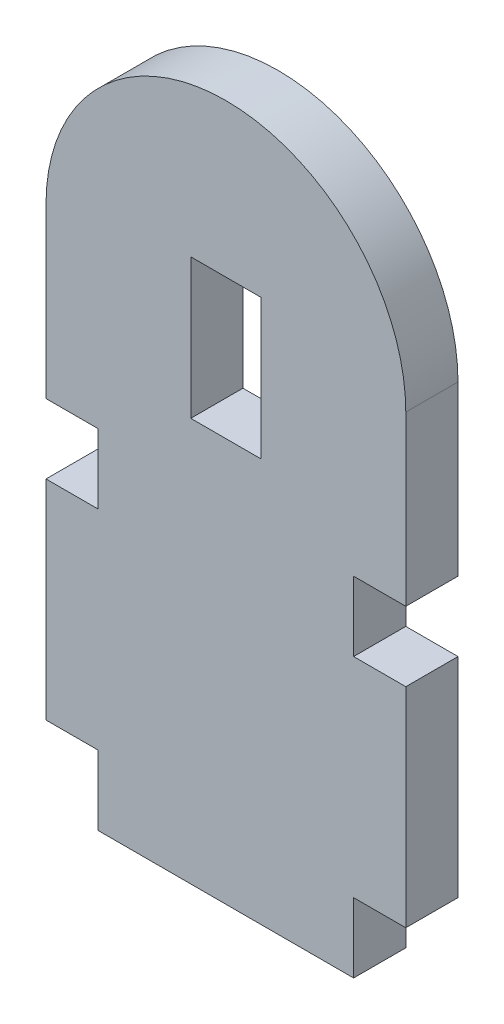
ISO-10303-21;
HEADER;
FILE_DESCRIPTION(('STEP AP214'),'2;1');
FILE_NAME('part.step','',(''),(''),'','','');
FILE_SCHEMA(('AUTOMOTIVE_DESIGN { 1 0 10303 214 1 1 1 1 }'));
ENDSEC;
DATA;
#1=APPLICATION_CONTEXT('core data for automotive mechanical design processes');
#2=APPLICATION_PROTOCOL_DEFINITION('international standard','automotive_design',2000,#1);
#3=PRODUCT_CONTEXT('',#1,'mechanical');
#4=PRODUCT('Part','Part','',(#3));
#5=PRODUCT_RELATED_PRODUCT_CATEGORY('part','',(#4));
#6=PRODUCT_DEFINITION_FORMATION('','',#4);
#7=PRODUCT_DEFINITION_CONTEXT('part definition',#1,'design');
#8=PRODUCT_DEFINITION('design','',#6,#7);
#9=PRODUCT_DEFINITION_SHAPE('','',#8);
#10=(LENGTH_UNIT() NAMED_UNIT(*) SI_UNIT(.MILLI.,.METRE.));
#11=(NAMED_UNIT(*) PLANE_ANGLE_UNIT() SI_UNIT($,.RADIAN.));
#12=(NAMED_UNIT(*) SI_UNIT($,.STERADIAN.) SOLID_ANGLE_UNIT());
#13=UNCERTAINTY_MEASURE_WITH_UNIT(LENGTH_MEASURE(1.E-05),#10,'distance_accuracy_value','');
#14=(GEOMETRIC_REPRESENTATION_CONTEXT(3) GLOBAL_UNCERTAINTY_ASSIGNED_CONTEXT((#13)) GLOBAL_UNIT_ASSIGNED_CONTEXT((#10,
#11,#12)) REPRESENTATION_CONTEXT('',''));
#15=CARTESIAN_POINT('',(0.,0.,0.));
#16=DIRECTION('',(0.,0.,1.));
#17=DIRECTION('',(1.,0.,0.));
#18=AXIS2_PLACEMENT_3D('',#15,#16,#17);
#19=CARTESIAN_POINT('',(1.44568823878412,73.3266826023532,15.));
#20=DIRECTION('',(0.,0.,1.));
#21=DIRECTION('',(1.,0.,0.));
#22=AXIS2_PLACEMENT_3D('',#19,#20,#21);
#23=PLANE('',#22);
#24=DIRECTION('',(0.,1.,0.));
#25=VECTOR('',#24,1.);
#26=CARTESIAN_POINT('',(53.1406882387841,-55.,15.));
#27=LINE('',#26,#25);
#28=CARTESIAN_POINT('',(53.1406882387841,-55.,15.));
#29=VERTEX_POINT('',#28);
#30=CARTESIAN_POINT('',(53.1406882387841,5.00000000000001,15.));
#31=VERTEX_POINT('',#30);
#32=EDGE_CURVE('E264',#29,#31,#27,.T.);
#33=ORIENTED_EDGE('',*,*,#32,.T.);
#34=DIRECTION('',(-1.,0.,0.));
#35=VECTOR('',#34,1.);
#36=CARTESIAN_POINT('',(53.1406882387841,5.00000000000001,15.));
#37=LINE('',#36,#35);
#38=CARTESIAN_POINT('',(38.1406882387842,5.00000000000001,15.));
#39=VERTEX_POINT('',#38);
#40=EDGE_CURVE('E267',#31,#39,#37,.T.);
#41=ORIENTED_EDGE('',*,*,#40,.T.);
#42=DIRECTION('',(0.,1.,0.));
#43=VECTOR('',#42,1.);
#44=CARTESIAN_POINT('',(38.1406882387842,5.00000000000001,15.));
#45=LINE('',#44,#43);
#46=CARTESIAN_POINT('',(38.1406882387841,25.,15.));
#47=VERTEX_POINT('',#46);
#48=EDGE_CURVE('E270',#39,#47,#45,.T.);
#49=ORIENTED_EDGE('',*,*,#48,.T.);
#50=DIRECTION('',(-1.,0.,0.));
#51=VECTOR('',#50,1.);
#52=CARTESIAN_POINT('',(53.1406882387841,25.,15.));
#53=LINE('',#52,#51);
#54=CARTESIAN_POINT('',(53.1406882387841,25.,15.));
#55=VERTEX_POINT('',#54);
#56=EDGE_CURVE('E272',#55,#47,#53,.T.);
#57=ORIENTED_EDGE('',*,*,#56,.F.);
#58=DIRECTION('',(0.,1.,0.));
#59=VECTOR('',#58,1.);
#60=CARTESIAN_POINT('',(53.1406882387841,25.,15.));
#61=LINE('',#60,#59);
#62=CARTESIAN_POINT('',(53.1406882387841,73.3266826023532,15.));
#63=VERTEX_POINT('',#62);
#64=EDGE_CURVE('E275',#55,#63,#61,.T.);
#65=ORIENTED_EDGE('',*,*,#64,.T.);
#66=CARTESIAN_POINT('',(1.44568823878412,73.3266826023532,15.));
#67=DIRECTION('',(0.,0.,1.));
#68=DIRECTION('',(1.,0.,0.));
#69=AXIS2_PLACEMENT_3D('',#66,#67,#68);
#70=CIRCLE('',#69,51.695);
#71=CARTESIAN_POINT('',(-50.2493117612159,73.3266826023532,15.));
#72=VERTEX_POINT('',#71);
#73=EDGE_CURVE('E277',#63,#72,#70,.T.);
#74=ORIENTED_EDGE('',*,*,#73,.T.);
#75=DIRECTION('',(0.,1.,0.));
#76=VECTOR('',#75,1.);
#77=CARTESIAN_POINT('',(-50.2493117612159,25.,15.));
#78=LINE('',#77,#76);
#79=CARTESIAN_POINT('',(-50.2493117612159,25.,15.));
#80=VERTEX_POINT('',#79);
#81=EDGE_CURVE('E279',#80,#72,#78,.T.);
#82=ORIENTED_EDGE('',*,*,#81,.F.);
#83=DIRECTION('',(1.,0.,0.));
#84=VECTOR('',#83,1.);
#85=CARTESIAN_POINT('',(-50.2493117612159,25.,15.));
#86=LINE('',#85,#84);
#87=CARTESIAN_POINT('',(-35.2493117612159,25.,15.));
#88=VERTEX_POINT('',#87);
#89=EDGE_CURVE('E282',#80,#88,#86,.T.);
#90=ORIENTED_EDGE('',*,*,#89,.T.);
#91=DIRECTION('',(0.,1.,0.));
#92=VECTOR('',#91,1.);
#93=CARTESIAN_POINT('',(-35.2493117612159,5.,15.));
#94=LINE('',#93,#92);
#95=CARTESIAN_POINT('',(-35.2493117612159,5.,15.));
#96=VERTEX_POINT('',#95);
#97=EDGE_CURVE('E284',#96,#88,#94,.T.);
#98=ORIENTED_EDGE('',*,*,#97,.F.);
#99=DIRECTION('',(1.,0.,0.));
#100=VECTOR('',#99,1.);
#101=CARTESIAN_POINT('',(-50.2493117612159,5.,15.));
#102=LINE('',#101,#100);
#103=CARTESIAN_POINT('',(-50.2493117612159,5.,15.));
#104=VERTEX_POINT('',#103);
#105=EDGE_CURVE('E287',#104,#96,#102,.T.);
#106=ORIENTED_EDGE('',*,*,#105,.F.);
#107=DIRECTION('',(0.,1.,0.));
#108=VECTOR('',#107,1.);
#109=CARTESIAN_POINT('',(-50.2493117612159,-55.,15.));
#110=LINE('',#109,#108);
#111=CARTESIAN_POINT('',(-50.2493117612159,-55.,15.));
#112=VERTEX_POINT('',#111);
#113=EDGE_CURVE('E290',#112,#104,#110,.T.);
#114=ORIENTED_EDGE('',*,*,#113,.F.);
#115=DIRECTION('',(1.,0.,0.));
#116=VECTOR('',#115,1.);
#117=CARTESIAN_POINT('',(-50.2493117612159,-55.,15.));
#118=LINE('',#117,#116);
#119=CARTESIAN_POINT('',(-35.2493117612159,-55.,15.));
#120=VERTEX_POINT('',#119);
#121=EDGE_CURVE('E293',#112,#120,#118,.T.);
#122=ORIENTED_EDGE('',*,*,#121,.T.);
#123=DIRECTION('',(0.,-1.,0.));
#124=VECTOR('',#123,1.);
#125=CARTESIAN_POINT('',(-35.2493117612159,-55.,15.));
#126=LINE('',#125,#124);
#127=CARTESIAN_POINT('',(-35.2493117612159,-75.,15.));
#128=VERTEX_POINT('',#127);
#129=EDGE_CURVE('E295',#120,#128,#126,.T.);
#130=ORIENTED_EDGE('',*,*,#129,.T.);
#131=DIRECTION('',(1.,0.,0.));
#132=VECTOR('',#131,1.);
#133=CARTESIAN_POINT('',(-35.2493117612159,-75.,15.));
#134=LINE('',#133,#132);
#135=CARTESIAN_POINT('',(38.1406882387842,-75.,15.));
#136=VERTEX_POINT('',#135);
#137=EDGE_CURVE('E297',#128,#136,#134,.T.);
#138=ORIENTED_EDGE('',*,*,#137,.T.);
#139=DIRECTION('',(0.,-1.,0.));
#140=VECTOR('',#139,1.);
#141=CARTESIAN_POINT('',(38.1406882387841,-55.,15.));
#142=LINE('',#141,#140);
#143=CARTESIAN_POINT('',(38.1406882387841,-55.,15.));
#144=VERTEX_POINT('',#143);
#145=EDGE_CURVE('E299',#144,#136,#142,.T.);
#146=ORIENTED_EDGE('',*,*,#145,.F.);
#147=DIRECTION('',(-1.,0.,0.));
#148=VECTOR('',#147,1.);
#149=CARTESIAN_POINT('',(53.1406882387841,-55.,15.));
#150=LINE('',#149,#148);
#151=EDGE_CURVE('E302',#29,#144,#150,.T.);
#152=ORIENTED_EDGE('',*,*,#151,.F.);
#153=EDGE_LOOP('',(#33,#41,#49,#57,#65,#74,#82,#90,#98,#106,#114,#122,#130,#138,#146,#152));
#154=FACE_BOUND('',#153,.T.);
#155=DIRECTION('',(0.,1.,0.));
#156=VECTOR('',#155,1.);
#157=CARTESIAN_POINT('',(11.5456882387841,40.8827675331254,15.));
#158=LINE('',#157,#156);
#159=CARTESIAN_POINT('',(11.5456882387841,40.8827675331254,15.));
#160=VERTEX_POINT('',#159);
#161=CARTESIAN_POINT('',(11.5456882387841,81.0827675331254,15.));
#162=VERTEX_POINT('',#161);
#163=EDGE_CURVE('E238',#160,#162,#158,.T.);
#164=ORIENTED_EDGE('',*,*,#163,.F.);
#165=DIRECTION('',(1.,0.,0.));
#166=VECTOR('',#165,1.);
#167=CARTESIAN_POINT('',(-8.65431176121588,40.8827675331254,15.));
#168=LINE('',#167,#166);
#169=CARTESIAN_POINT('',(-8.65431176121588,40.8827675331254,15.));
#170=VERTEX_POINT('',#169);
#171=EDGE_CURVE('E229',#170,#160,#168,.T.);
#172=ORIENTED_EDGE('',*,*,#171,.F.);
#173=DIRECTION('',(0.,1.,0.));
#174=VECTOR('',#173,1.);
#175=CARTESIAN_POINT('',(-8.65431176121588,40.8827675331254,15.));
#176=LINE('',#175,#174);
#177=CARTESIAN_POINT('',(-8.65431176121588,81.0827675331254,15.));
#178=VERTEX_POINT('',#177);
#179=EDGE_CURVE('E249',#170,#178,#176,.T.);
#180=ORIENTED_EDGE('',*,*,#179,.T.);
#181=DIRECTION('',(1.,0.,0.));
#182=VECTOR('',#181,1.);
#183=CARTESIAN_POINT('',(-8.65431176121588,81.0827675331254,15.));
#184=LINE('',#183,#182);
#185=EDGE_CURVE('E107',#178,#162,#184,.T.);
#186=ORIENTED_EDGE('',*,*,#185,.T.);
#187=EDGE_LOOP('',(#164,#172,#180,#186));
#188=FACE_BOUND('',#187,.T.);
#189=ADVANCED_FACE('F92',(#154,#188),#23,.T.);
#190=CARTESIAN_POINT('',(1.44568823878412,73.3266826023532,0.));
#191=DIRECTION('',(0.,0.,1.));
#192=DIRECTION('',(1.,0.,0.));
#193=AXIS2_PLACEMENT_3D('',#190,#191,#192);
#194=PLANE('',#193);
#195=DIRECTION('',(0.,1.,0.));
#196=VECTOR('',#195,1.);
#197=CARTESIAN_POINT('',(53.1406882387841,-55.,0.));
#198=LINE('',#197,#196);
#199=CARTESIAN_POINT('',(53.1406882387841,-55.,0.));
#200=VERTEX_POINT('',#199);
#201=CARTESIAN_POINT('',(53.1406882387841,5.00000000000001,0.));
#202=VERTEX_POINT('',#201);
#203=EDGE_CURVE('E245',#200,#202,#198,.T.);
#204=ORIENTED_EDGE('',*,*,#203,.F.);
#205=DIRECTION('',(-1.,0.,0.));
#206=VECTOR('',#205,1.);
#207=CARTESIAN_POINT('',(53.1406882387841,-55.,0.));
#208=LINE('',#207,#206);
#209=CARTESIAN_POINT('',(38.1406882387841,-55.,0.));
#210=VERTEX_POINT('',#209);
#211=EDGE_CURVE('E268',#200,#210,#208,.T.);
#212=ORIENTED_EDGE('',*,*,#211,.T.);
#213=DIRECTION('',(0.,-1.,0.));
#214=VECTOR('',#213,1.);
#215=CARTESIAN_POINT('',(38.1406882387841,-55.,0.));
#216=LINE('',#215,#214);
#217=CARTESIAN_POINT('',(38.1406882387842,-75.,0.));
#218=VERTEX_POINT('',#217);
#219=EDGE_CURVE('E343',#210,#218,#216,.T.);
#220=ORIENTED_EDGE('',*,*,#219,.T.);
#221=DIRECTION('',(1.,0.,0.));
#222=VECTOR('',#221,1.);
#223=CARTESIAN_POINT('',(-35.2493117612159,-75.,0.));
#224=LINE('',#223,#222);
#225=CARTESIAN_POINT('',(-35.2493117612159,-75.,0.));
#226=VERTEX_POINT('',#225);
#227=EDGE_CURVE('E340',#226,#218,#224,.T.);
#228=ORIENTED_EDGE('',*,*,#227,.F.);
#229=DIRECTION('',(0.,-1.,0.));
#230=VECTOR('',#229,1.);
#231=CARTESIAN_POINT('',(-35.2493117612159,-55.,0.));
#232=LINE('',#231,#230);
#233=CARTESIAN_POINT('',(-35.2493117612159,-55.,0.));
#234=VERTEX_POINT('',#233);
#235=EDGE_CURVE('E338',#234,#226,#232,.T.);
#236=ORIENTED_EDGE('',*,*,#235,.F.);
#237=DIRECTION('',(1.,0.,0.));
#238=VECTOR('',#237,1.);
#239=CARTESIAN_POINT('',(-50.2493117612159,-55.,0.));
#240=LINE('',#239,#238);
#241=CARTESIAN_POINT('',(-50.2493117612159,-55.,0.));
#242=VERTEX_POINT('',#241);
#243=EDGE_CURVE('E336',#242,#234,#240,.T.);
#244=ORIENTED_EDGE('',*,*,#243,.F.);
#245=DIRECTION('',(0.,1.,0.));
#246=VECTOR('',#245,1.);
#247=CARTESIAN_POINT('',(-50.2493117612159,-55.,0.));
#248=LINE('',#247,#246);
#249=CARTESIAN_POINT('',(-50.2493117612159,5.,0.));
#250=VERTEX_POINT('',#249);
#251=EDGE_CURVE('E333',#242,#250,#248,.T.);
#252=ORIENTED_EDGE('',*,*,#251,.T.);
#253=DIRECTION('',(1.,0.,0.));
#254=VECTOR('',#253,1.);
#255=CARTESIAN_POINT('',(-50.2493117612159,5.,0.));
#256=LINE('',#255,#254);
#257=CARTESIAN_POINT('',(-35.2493117612159,5.,0.));
#258=VERTEX_POINT('',#257);
#259=EDGE_CURVE('E330',#250,#258,#256,.T.);
#260=ORIENTED_EDGE('',*,*,#259,.T.);
#261=DIRECTION('',(0.,1.,0.));
#262=VECTOR('',#261,1.);
#263=CARTESIAN_POINT('',(-35.2493117612159,5.,0.));
#264=LINE('',#263,#262);
#265=CARTESIAN_POINT('',(-35.2493117612159,25.,0.));
#266=VERTEX_POINT('',#265);
#267=EDGE_CURVE('E327',#258,#266,#264,.T.);
#268=ORIENTED_EDGE('',*,*,#267,.T.);
#269=DIRECTION('',(1.,0.,0.));
#270=VECTOR('',#269,1.);
#271=CARTESIAN_POINT('',(-50.2493117612159,25.,0.));
#272=LINE('',#271,#270);
#273=CARTESIAN_POINT('',(-50.2493117612159,25.,0.));
#274=VERTEX_POINT('',#273);
#275=EDGE_CURVE('E324',#274,#266,#272,.T.);
#276=ORIENTED_EDGE('',*,*,#275,.F.);
#277=DIRECTION('',(0.,1.,0.));
#278=VECTOR('',#277,1.);
#279=CARTESIAN_POINT('',(-50.2493117612159,25.,0.));
#280=LINE('',#279,#278);
#281=CARTESIAN_POINT('',(-50.2493117612159,73.3266826023532,0.));
#282=VERTEX_POINT('',#281);
#283=EDGE_CURVE('E321',#274,#282,#280,.T.);
#284=ORIENTED_EDGE('',*,*,#283,.T.);
#285=CARTESIAN_POINT('',(1.44568823878412,73.3266826023532,0.));
#286=DIRECTION('',(0.,0.,1.));
#287=DIRECTION('',(1.,0.,0.));
#288=AXIS2_PLACEMENT_3D('',#285,#286,#287);
#289=CIRCLE('',#288,51.695);
#290=CARTESIAN_POINT('',(53.1406882387841,73.3266826023532,0.));
#291=VERTEX_POINT('',#290);
#292=EDGE_CURVE('E318',#291,#282,#289,.T.);
#293=ORIENTED_EDGE('',*,*,#292,.F.);
#294=DIRECTION('',(0.,1.,0.));
#295=VECTOR('',#294,1.);
#296=CARTESIAN_POINT('',(53.1406882387841,25.,0.));
#297=LINE('',#296,#295);
#298=CARTESIAN_POINT('',(53.1406882387841,25.,0.));
#299=VERTEX_POINT('',#298);
#300=EDGE_CURVE('E316',#299,#291,#297,.T.);
#301=ORIENTED_EDGE('',*,*,#300,.F.);
#302=DIRECTION('',(-1.,0.,0.));
#303=VECTOR('',#302,1.);
#304=CARTESIAN_POINT('',(53.1406882387841,25.,0.));
#305=LINE('',#304,#303);
#306=CARTESIAN_POINT('',(38.1406882387841,25.,0.));
#307=VERTEX_POINT('',#306);
#308=EDGE_CURVE('E313',#299,#307,#305,.T.);
#309=ORIENTED_EDGE('',*,*,#308,.T.);
#310=DIRECTION('',(0.,1.,0.));
#311=VECTOR('',#310,1.);
#312=CARTESIAN_POINT('',(38.1406882387842,5.00000000000001,0.));
#313=LINE('',#312,#311);
#314=CARTESIAN_POINT('',(38.1406882387842,5.00000000000001,0.));
#315=VERTEX_POINT('',#314);
#316=EDGE_CURVE('E310',#315,#307,#313,.T.);
#317=ORIENTED_EDGE('',*,*,#316,.F.);
#318=DIRECTION('',(-1.,0.,0.));
#319=VECTOR('',#318,1.);
#320=CARTESIAN_POINT('',(53.1406882387841,5.00000000000001,0.));
#321=LINE('',#320,#319);
#322=EDGE_CURVE('E308',#202,#315,#321,.T.);
#323=ORIENTED_EDGE('',*,*,#322,.F.);
#324=EDGE_LOOP('',(#204,#212,#220,#228,#236,#244,#252,#260,#268,#276,#284,#293,#301,#309,#317,#323));
#325=FACE_BOUND('',#324,.T.);
#326=DIRECTION('',(1.,0.,0.));
#327=VECTOR('',#326,1.);
#328=CARTESIAN_POINT('',(-8.65431176121588,40.8827675331254,0.));
#329=LINE('',#328,#327);
#330=CARTESIAN_POINT('',(-8.65431176121588,40.8827675331254,0.));
#331=VERTEX_POINT('',#330);
#332=CARTESIAN_POINT('',(11.5456882387841,40.8827675331254,0.));
#333=VERTEX_POINT('',#332);
#334=EDGE_CURVE('E115',#331,#333,#329,.T.);
#335=ORIENTED_EDGE('',*,*,#334,.T.);
#336=DIRECTION('',(0.,1.,0.));
#337=VECTOR('',#336,1.);
#338=CARTESIAN_POINT('',(11.5456882387841,40.8827675331254,0.));
#339=LINE('',#338,#337);
#340=CARTESIAN_POINT('',(11.5456882387841,81.0827675331254,0.));
#341=VERTEX_POINT('',#340);
#342=EDGE_CURVE('E244',#333,#341,#339,.T.);
#343=ORIENTED_EDGE('',*,*,#342,.T.);
#344=DIRECTION('',(1.,0.,0.));
#345=VECTOR('',#344,1.);
#346=CARTESIAN_POINT('',(-8.65431176121588,81.0827675331254,0.));
#347=LINE('',#346,#345);
#348=CARTESIAN_POINT('',(-8.65431176121588,81.0827675331254,0.));
#349=VERTEX_POINT('',#348);
#350=EDGE_CURVE('E255',#349,#341,#347,.T.);
#351=ORIENTED_EDGE('',*,*,#350,.F.);
#352=DIRECTION('',(0.,1.,0.));
#353=VECTOR('',#352,1.);
#354=CARTESIAN_POINT('',(-8.65431176121588,40.8827675331254,0.));
#355=LINE('',#354,#353);
#356=EDGE_CURVE('E239',#331,#349,#355,.T.);
#357=ORIENTED_EDGE('',*,*,#356,.F.);
#358=EDGE_LOOP('',(#335,#343,#351,#357));
#359=FACE_BOUND('',#358,.T.);
#360=ADVANCED_FACE('F387',(#325,#359),#194,.F.);
#361=CARTESIAN_POINT('',(53.1406882387841,-55.,15.));
#362=DIRECTION('',(-1.,0.,0.));
#363=DIRECTION('',(0.,0.,1.));
#364=AXIS2_PLACEMENT_3D('',#361,#362,#363);
#365=PLANE('',#364);
#366=ORIENTED_EDGE('',*,*,#203,.T.);
#367=DIRECTION('',(0.,0.,-1.));
#368=VECTOR('',#367,1.);
#369=CARTESIAN_POINT('',(53.1406882387841,5.00000000000001,15.));
#370=LINE('',#369,#368);
#371=EDGE_CURVE('E12',#31,#202,#370,.T.);
#372=ORIENTED_EDGE('',*,*,#371,.F.);
#373=ORIENTED_EDGE('',*,*,#32,.F.);
#374=DIRECTION('',(0.,0.,-1.));
#375=VECTOR('',#374,1.);
#376=CARTESIAN_POINT('',(53.1406882387841,-55.,15.));
#377=LINE('',#376,#375);
#378=EDGE_CURVE('E305',#29,#200,#377,.T.);
#379=ORIENTED_EDGE('',*,*,#378,.T.);
#380=EDGE_LOOP('',(#366,#372,#373,#379));
#381=FACE_BOUND('',#380,.T.);
#382=ADVANCED_FACE('F94',(#381),#365,.F.);
#383=CARTESIAN_POINT('',(53.1406882387841,5.00000000000001,15.));
#384=DIRECTION('',(0.,-1.,0.));
#385=DIRECTION('',(0.,0.,-1.));
#386=AXIS2_PLACEMENT_3D('',#383,#384,#385);
#387=PLANE('',#386);
#388=ORIENTED_EDGE('',*,*,#322,.T.);
#389=DIRECTION('',(0.,0.,-1.));
#390=VECTOR('',#389,1.);
#391=CARTESIAN_POINT('',(38.1406882387842,5.00000000000001,15.));
#392=LINE('',#391,#390);
#393=EDGE_CURVE('E100',#39,#315,#392,.T.);
#394=ORIENTED_EDGE('',*,*,#393,.F.);
#395=ORIENTED_EDGE('',*,*,#40,.F.);
#396=ORIENTED_EDGE('',*,*,#371,.T.);
#397=EDGE_LOOP('',(#388,#394,#395,#396));
#398=FACE_BOUND('',#397,.T.);
#399=ADVANCED_FACE('F401',(#398),#387,.F.);
#400=CARTESIAN_POINT('',(38.1406882387842,5.00000000000001,15.));
#401=DIRECTION('',(-1.,0.,0.));
#402=DIRECTION('',(0.,-1.,0.));
#403=AXIS2_PLACEMENT_3D('',#400,#401,#402);
#404=PLANE('',#403);
#405=ORIENTED_EDGE('',*,*,#316,.T.);
#406=DIRECTION('',(0.,0.,-1.));
#407=VECTOR('',#406,1.);
#408=CARTESIAN_POINT('',(38.1406882387841,25.,15.));
#409=LINE('',#408,#407);
#410=EDGE_CURVE('E376',#47,#307,#409,.T.);
#411=ORIENTED_EDGE('',*,*,#410,.F.);
#412=ORIENTED_EDGE('',*,*,#48,.F.);
#413=ORIENTED_EDGE('',*,*,#393,.T.);
#414=EDGE_LOOP('',(#405,#411,#412,#413));
#415=FACE_BOUND('',#414,.T.);
#416=ADVANCED_FACE('F382',(#415),#404,.F.);
#417=CARTESIAN_POINT('',(53.1406882387841,25.,15.));
#418=DIRECTION('',(0.,-1.,0.));
#419=DIRECTION('',(1.,0.,0.));
#420=AXIS2_PLACEMENT_3D('',#417,#418,#419);
#421=PLANE('',#420);
#422=ORIENTED_EDGE('',*,*,#308,.F.);
#423=DIRECTION('',(0.,0.,-1.));
#424=VECTOR('',#423,1.);
#425=CARTESIAN_POINT('',(53.1406882387841,25.,15.));
#426=LINE('',#425,#424);
#427=EDGE_CURVE('E374',#55,#299,#426,.T.);
#428=ORIENTED_EDGE('',*,*,#427,.F.);
#429=ORIENTED_EDGE('',*,*,#56,.T.);
#430=ORIENTED_EDGE('',*,*,#410,.T.);
#431=EDGE_LOOP('',(#422,#428,#429,#430));
#432=FACE_BOUND('',#431,.T.);
#433=ADVANCED_FACE('F393',(#432),#421,.T.);
#434=CARTESIAN_POINT('',(53.1406882387841,25.,15.));
#435=DIRECTION('',(-1.,0.,0.));
#436=DIRECTION('',(0.,-1.,0.));
#437=AXIS2_PLACEMENT_3D('',#434,#435,#436);
#438=PLANE('',#437);
#439=ORIENTED_EDGE('',*,*,#300,.T.);
#440=DIRECTION('',(0.,0.,-1.));
#441=VECTOR('',#440,1.);
#442=CARTESIAN_POINT('',(53.1406882387841,73.3266826023532,15.));
#443=LINE('',#442,#441);
#444=EDGE_CURVE('E371',#63,#291,#443,.T.);
#445=ORIENTED_EDGE('',*,*,#444,.F.);
#446=ORIENTED_EDGE('',*,*,#64,.F.);
#447=ORIENTED_EDGE('',*,*,#427,.T.);
#448=EDGE_LOOP('',(#439,#445,#446,#447));
#449=FACE_BOUND('',#448,.T.);
#450=ADVANCED_FACE('F451',(#449),#438,.F.);
#451=CARTESIAN_POINT('',(1.44568823878412,73.3266826023532,15.));
#452=DIRECTION('',(0.,0.,-1.));
#453=DIRECTION('',(-1.,0.,0.));
#454=AXIS2_PLACEMENT_3D('',#451,#452,#453);
#455=CYLINDRICAL_SURFACE('',#454,51.695);
#456=ORIENTED_EDGE('',*,*,#292,.T.);
#457=DIRECTION('',(0.,0.,-1.));
#458=VECTOR('',#457,1.);
#459=CARTESIAN_POINT('',(-50.2493117612159,73.3266826023532,15.));
#460=LINE('',#459,#458);
#461=EDGE_CURVE('E369',#72,#282,#460,.T.);
#462=ORIENTED_EDGE('',*,*,#461,.F.);
#463=ORIENTED_EDGE('',*,*,#73,.F.);
#464=ORIENTED_EDGE('',*,*,#444,.T.);
#465=EDGE_LOOP('',(#456,#462,#463,#464));
#466=FACE_BOUND('',#465,.T.);
#467=ADVANCED_FACE('F448',(#466),#455,.T.);
#468=CARTESIAN_POINT('',(-50.2493117612159,25.,15.));
#469=DIRECTION('',(-1.,0.,0.));
#470=DIRECTION('',(0.,0.,1.));
#471=AXIS2_PLACEMENT_3D('',#468,#469,#470);
#472=PLANE('',#471);
#473=ORIENTED_EDGE('',*,*,#283,.F.);
#474=DIRECTION('',(0.,0.,-1.));
#475=VECTOR('',#474,1.);
#476=CARTESIAN_POINT('',(-50.2493117612159,25.,15.));
#477=LINE('',#476,#475);
#478=EDGE_CURVE('E367',#80,#274,#477,.T.);
#479=ORIENTED_EDGE('',*,*,#478,.F.);
#480=ORIENTED_EDGE('',*,*,#81,.T.);
#481=ORIENTED_EDGE('',*,*,#461,.T.);
#482=EDGE_LOOP('',(#473,#479,#480,#481));
#483=FACE_BOUND('',#482,.T.);
#484=ADVANCED_FACE('F445',(#483),#472,.T.);
#485=CARTESIAN_POINT('',(-50.2493117612159,25.,15.));
#486=DIRECTION('',(0.,1.,0.));
#487=DIRECTION('',(-1.,0.,0.));
#488=AXIS2_PLACEMENT_3D('',#485,#486,#487);
#489=PLANE('',#488);
#490=ORIENTED_EDGE('',*,*,#275,.T.);
#491=DIRECTION('',(0.,0.,-1.));
#492=VECTOR('',#491,1.);
#493=CARTESIAN_POINT('',(-35.2493117612159,25.,15.));
#494=LINE('',#493,#492);
#495=EDGE_CURVE('E365',#88,#266,#494,.T.);
#496=ORIENTED_EDGE('',*,*,#495,.F.);
#497=ORIENTED_EDGE('',*,*,#89,.F.);
#498=ORIENTED_EDGE('',*,*,#478,.T.);
#499=EDGE_LOOP('',(#490,#496,#497,#498));
#500=FACE_BOUND('',#499,.T.);
#501=ADVANCED_FACE('F442',(#500),#489,.F.);
#502=CARTESIAN_POINT('',(-35.2493117612159,5.,15.));
#503=DIRECTION('',(-1.,0.,0.));
#504=DIRECTION('',(0.,-1.,0.));
#505=AXIS2_PLACEMENT_3D('',#502,#503,#504);
#506=PLANE('',#505);
#507=ORIENTED_EDGE('',*,*,#267,.F.);
#508=DIRECTION('',(0.,0.,-1.));
#509=VECTOR('',#508,1.);
#510=CARTESIAN_POINT('',(-35.2493117612159,5.,15.));
#511=LINE('',#510,#509);
#512=EDGE_CURVE('E363',#96,#258,#511,.T.);
#513=ORIENTED_EDGE('',*,*,#512,.F.);
#514=ORIENTED_EDGE('',*,*,#97,.T.);
#515=ORIENTED_EDGE('',*,*,#495,.T.);
#516=EDGE_LOOP('',(#507,#513,#514,#515));
#517=FACE_BOUND('',#516,.T.);
#518=ADVANCED_FACE('F437',(#517),#506,.T.);
#519=CARTESIAN_POINT('',(-50.2493117612159,5.,15.));
#520=DIRECTION('',(0.,1.,0.));
#521=DIRECTION('',(-1.,0.,0.));
#522=AXIS2_PLACEMENT_3D('',#519,#520,#521);
#523=PLANE('',#522);
#524=ORIENTED_EDGE('',*,*,#259,.F.);
#525=DIRECTION('',(0.,0.,-1.));
#526=VECTOR('',#525,1.);
#527=CARTESIAN_POINT('',(-50.2493117612159,5.,15.));
#528=LINE('',#527,#526);
#529=EDGE_CURVE('E361',#104,#250,#528,.T.);
#530=ORIENTED_EDGE('',*,*,#529,.F.);
#531=ORIENTED_EDGE('',*,*,#105,.T.);
#532=ORIENTED_EDGE('',*,*,#512,.T.);
#533=EDGE_LOOP('',(#524,#530,#531,#532));
#534=FACE_BOUND('',#533,.T.);
#535=ADVANCED_FACE('F432',(#534),#523,.T.);
#536=CARTESIAN_POINT('',(-50.2493117612159,-55.,15.));
#537=DIRECTION('',(-1.,0.,0.));
#538=DIRECTION('',(0.,-1.,0.));
#539=AXIS2_PLACEMENT_3D('',#536,#537,#538);
#540=PLANE('',#539);
#541=ORIENTED_EDGE('',*,*,#251,.F.);
#542=DIRECTION('',(0.,0.,-1.));
#543=VECTOR('',#542,1.);
#544=CARTESIAN_POINT('',(-50.2493117612159,-55.,15.));
#545=LINE('',#544,#543);
#546=EDGE_CURVE('E359',#112,#242,#545,.T.);
#547=ORIENTED_EDGE('',*,*,#546,.F.);
#548=ORIENTED_EDGE('',*,*,#113,.T.);
#549=ORIENTED_EDGE('',*,*,#529,.T.);
#550=EDGE_LOOP('',(#541,#547,#548,#549));
#551=FACE_BOUND('',#550,.T.);
#552=ADVANCED_FACE('F428',(#551),#540,.T.);
#553=CARTESIAN_POINT('',(-50.2493117612159,-55.,15.));
#554=DIRECTION('',(0.,1.,0.));
#555=DIRECTION('',(-1.,0.,0.));
#556=AXIS2_PLACEMENT_3D('',#553,#554,#555);
#557=PLANE('',#556);
#558=ORIENTED_EDGE('',*,*,#243,.T.);
#559=DIRECTION('',(0.,0.,-1.));
#560=VECTOR('',#559,1.);
#561=CARTESIAN_POINT('',(-35.2493117612159,-55.,15.));
#562=LINE('',#561,#560);
#563=EDGE_CURVE('E356',#120,#234,#562,.T.);
#564=ORIENTED_EDGE('',*,*,#563,.F.);
#565=ORIENTED_EDGE('',*,*,#121,.F.);
#566=ORIENTED_EDGE('',*,*,#546,.T.);
#567=EDGE_LOOP('',(#558,#564,#565,#566));
#568=FACE_BOUND('',#567,.T.);
#569=ADVANCED_FACE('F424',(#568),#557,.F.);
#570=CARTESIAN_POINT('',(-35.2493117612159,-55.,15.));
#571=DIRECTION('',(1.,0.,0.));
#572=DIRECTION('',(0.,0.,-1.));
#573=AXIS2_PLACEMENT_3D('',#570,#571,#572);
#574=PLANE('',#573);
#575=ORIENTED_EDGE('',*,*,#235,.T.);
#576=DIRECTION('',(0.,0.,-1.));
#577=VECTOR('',#576,1.);
#578=CARTESIAN_POINT('',(-35.2493117612159,-75.,15.));
#579=LINE('',#578,#577);
#580=EDGE_CURVE('E353',#128,#226,#579,.T.);
#581=ORIENTED_EDGE('',*,*,#580,.F.);
#582=ORIENTED_EDGE('',*,*,#129,.F.);
#583=ORIENTED_EDGE('',*,*,#563,.T.);
#584=EDGE_LOOP('',(#575,#581,#582,#583));
#585=FACE_BOUND('',#584,.T.);
#586=ADVANCED_FACE('F420',(#585),#574,.F.);
#587=CARTESIAN_POINT('',(-35.2493117612159,-75.,15.));
#588=DIRECTION('',(0.,1.,0.));
#589=DIRECTION('',(-1.,0.,0.));
#590=AXIS2_PLACEMENT_3D('',#587,#588,#589);
#591=PLANE('',#590);
#592=ORIENTED_EDGE('',*,*,#227,.T.);
#593=DIRECTION('',(0.,0.,-1.));
#594=VECTOR('',#593,1.);
#595=CARTESIAN_POINT('',(38.1406882387842,-75.,15.));
#596=LINE('',#595,#594);
#597=EDGE_CURVE('E351',#136,#218,#596,.T.);
#598=ORIENTED_EDGE('',*,*,#597,.F.);
#599=ORIENTED_EDGE('',*,*,#137,.F.);
#600=ORIENTED_EDGE('',*,*,#580,.T.);
#601=EDGE_LOOP('',(#592,#598,#599,#600));
#602=FACE_BOUND('',#601,.T.);
#603=ADVANCED_FACE('F415',(#602),#591,.F.);
#604=CARTESIAN_POINT('',(38.1406882387841,-55.,15.));
#605=DIRECTION('',(1.,0.,0.));
#606=DIRECTION('',(0.,1.,0.));
#607=AXIS2_PLACEMENT_3D('',#604,#605,#606);
#608=PLANE('',#607);
#609=ORIENTED_EDGE('',*,*,#219,.F.);
#610=DIRECTION('',(0.,0.,-1.));
#611=VECTOR('',#610,1.);
#612=CARTESIAN_POINT('',(38.1406882387841,-55.,15.));
#613=LINE('',#612,#611);
#614=EDGE_CURVE('E349',#144,#210,#613,.T.);
#615=ORIENTED_EDGE('',*,*,#614,.F.);
#616=ORIENTED_EDGE('',*,*,#145,.T.);
#617=ORIENTED_EDGE('',*,*,#597,.T.);
#618=EDGE_LOOP('',(#609,#615,#616,#617));
#619=FACE_BOUND('',#618,.T.);
#620=ADVANCED_FACE('F409',(#619),#608,.T.);
#621=CARTESIAN_POINT('',(53.1406882387841,-55.,15.));
#622=DIRECTION('',(0.,-1.,0.));
#623=DIRECTION('',(1.,0.,0.));
#624=AXIS2_PLACEMENT_3D('',#621,#622,#623);
#625=PLANE('',#624);
#626=ORIENTED_EDGE('',*,*,#211,.F.);
#627=ORIENTED_EDGE('',*,*,#378,.F.);
#628=ORIENTED_EDGE('',*,*,#151,.T.);
#629=ORIENTED_EDGE('',*,*,#614,.T.);
#630=EDGE_LOOP('',(#626,#627,#628,#629));
#631=FACE_BOUND('',#630,.T.);
#632=ADVANCED_FACE('F405',(#631),#625,.T.);
#633=CARTESIAN_POINT('',(-8.65431176121588,40.8827675331254,15.));
#634=DIRECTION('',(0.,1.,0.));
#635=DIRECTION('',(0.,0.,1.));
#636=AXIS2_PLACEMENT_3D('',#633,#634,#635);
#637=PLANE('',#636);
#638=ORIENTED_EDGE('',*,*,#334,.F.);
#639=DIRECTION('',(0.,0.,-1.));
#640=VECTOR('',#639,1.);
#641=CARTESIAN_POINT('',(-8.65431176121588,40.8827675331254,15.));
#642=LINE('',#641,#640);
#643=EDGE_CURVE('E233',#170,#331,#642,.T.);
#644=ORIENTED_EDGE('',*,*,#643,.F.);
#645=ORIENTED_EDGE('',*,*,#171,.T.);
#646=DIRECTION('',(0.,0.,-1.));
#647=VECTOR('',#646,1.);
#648=CARTESIAN_POINT('',(11.5456882387841,40.8827675331254,15.));
#649=LINE('',#648,#647);
#650=EDGE_CURVE('E232',#160,#333,#649,.T.);
#651=ORIENTED_EDGE('',*,*,#650,.T.);
#652=EDGE_LOOP('',(#638,#644,#645,#651));
#653=FACE_BOUND('',#652,.T.);
#654=ADVANCED_FACE('F231',(#653),#637,.T.);
#655=CARTESIAN_POINT('',(11.5456882387841,40.8827675331254,15.));
#656=DIRECTION('',(-1.,0.,0.));
#657=DIRECTION('',(0.,0.,1.));
#658=AXIS2_PLACEMENT_3D('',#655,#656,#657);
#659=PLANE('',#658);
#660=ORIENTED_EDGE('',*,*,#342,.F.);
#661=ORIENTED_EDGE('',*,*,#650,.F.);
#662=ORIENTED_EDGE('',*,*,#163,.T.);
#663=DIRECTION('',(0.,0.,-1.));
#664=VECTOR('',#663,1.);
#665=CARTESIAN_POINT('',(11.5456882387841,81.0827675331254,15.));
#666=LINE('',#665,#664);
#667=EDGE_CURVE('E246',#162,#341,#666,.T.);
#668=ORIENTED_EDGE('',*,*,#667,.T.);
#669=EDGE_LOOP('',(#660,#661,#662,#668));
#670=FACE_BOUND('',#669,.T.);
#671=ADVANCED_FACE('F242',(#670),#659,.T.);
#672=CARTESIAN_POINT('',(-8.65431176121588,81.0827675331254,15.));
#673=DIRECTION('',(0.,1.,0.));
#674=DIRECTION('',(0.,0.,1.));
#675=AXIS2_PLACEMENT_3D('',#672,#673,#674);
#676=PLANE('',#675);
#677=ORIENTED_EDGE('',*,*,#350,.T.);
#678=ORIENTED_EDGE('',*,*,#667,.F.);
#679=ORIENTED_EDGE('',*,*,#185,.F.);
#680=DIRECTION('',(0.,0.,-1.));
#681=VECTOR('',#680,1.);
#682=CARTESIAN_POINT('',(-8.65431176121588,81.0827675331254,15.));
#683=LINE('',#682,#681);
#684=EDGE_CURVE('E261',#178,#349,#683,.T.);
#685=ORIENTED_EDGE('',*,*,#684,.T.);
#686=EDGE_LOOP('',(#677,#678,#679,#685));
#687=FACE_BOUND('',#686,.T.);
#688=ADVANCED_FACE('F539',(#687),#676,.F.);
#689=CARTESIAN_POINT('',(-8.65431176121588,40.8827675331254,15.));
#690=DIRECTION('',(-1.,0.,0.));
#691=DIRECTION('',(0.,0.,1.));
#692=AXIS2_PLACEMENT_3D('',#689,#690,#691);
#693=PLANE('',#692);
#694=ORIENTED_EDGE('',*,*,#356,.T.);
#695=ORIENTED_EDGE('',*,*,#684,.F.);
#696=ORIENTED_EDGE('',*,*,#179,.F.);
#697=ORIENTED_EDGE('',*,*,#643,.T.);
#698=EDGE_LOOP('',(#694,#695,#696,#697));
#699=FACE_BOUND('',#698,.T.);
#700=ADVANCED_FACE('F545',(#699),#693,.F.);
#701=CLOSED_SHELL('',(#189,#360,#382,#399,#416,#433,#450,#467,#484,#501,#518,#535,#552,#569,
#586,#603,#620,#632,#654,#671,#688,#700));
#702=MANIFOLD_SOLID_BREP('B2',#701);
#703=ADVANCED_BREP_SHAPE_REPRESENTATION('',(#18,#702),#14);
#704=SHAPE_DEFINITION_REPRESENTATION(#9,#703);
ENDSEC;
END-ISO-10303-21;
